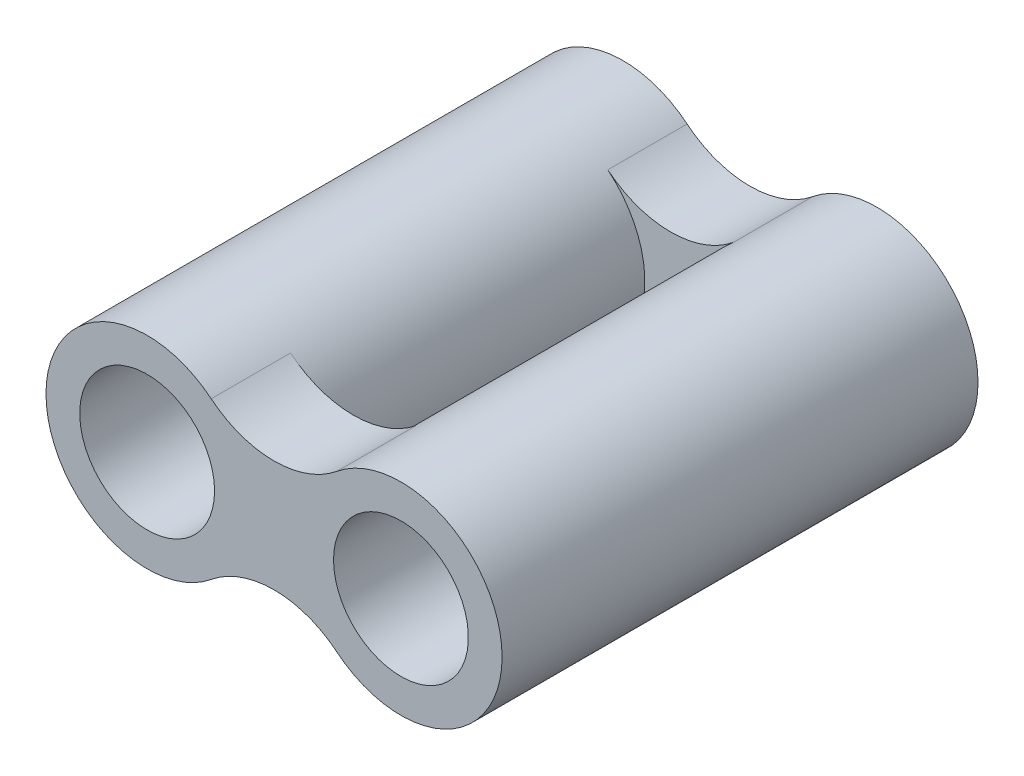
ISO-10303-21;
HEADER;
FILE_DESCRIPTION(('STEP AP214'),'2;1');
FILE_NAME('part.step','',(''),(''),'','','');
FILE_SCHEMA(('AUTOMOTIVE_DESIGN { 1 0 10303 214 1 1 1 1 }'));
ENDSEC;
DATA;
#1=APPLICATION_CONTEXT('core data for automotive mechanical design processes');
#2=APPLICATION_PROTOCOL_DEFINITION('international standard','automotive_design',2000,#1);
#3=PRODUCT_CONTEXT('',#1,'mechanical');
#4=PRODUCT('Part','Part','',(#3));
#5=PRODUCT_RELATED_PRODUCT_CATEGORY('part','',(#4));
#6=PRODUCT_DEFINITION_FORMATION('','',#4);
#7=PRODUCT_DEFINITION_CONTEXT('part definition',#1,'design');
#8=PRODUCT_DEFINITION('design','',#6,#7);
#9=PRODUCT_DEFINITION_SHAPE('','',#8);
#10=(LENGTH_UNIT() NAMED_UNIT(*) SI_UNIT(.MILLI.,.METRE.));
#11=(NAMED_UNIT(*) PLANE_ANGLE_UNIT() SI_UNIT($,.RADIAN.));
#12=(NAMED_UNIT(*) SI_UNIT($,.STERADIAN.) SOLID_ANGLE_UNIT());
#13=UNCERTAINTY_MEASURE_WITH_UNIT(LENGTH_MEASURE(1.E-05),#10,'distance_accuracy_value','');
#14=(GEOMETRIC_REPRESENTATION_CONTEXT(3) GLOBAL_UNCERTAINTY_ASSIGNED_CONTEXT((#13)) GLOBAL_UNIT_ASSIGNED_CONTEXT((#10,
#11,#12)) REPRESENTATION_CONTEXT('',''));
#15=CARTESIAN_POINT('',(0.,0.,0.));
#16=DIRECTION('',(0.,0.,1.));
#17=DIRECTION('',(1.,0.,0.));
#18=AXIS2_PLACEMENT_3D('',#15,#16,#17);
#19=CARTESIAN_POINT('',(1.6,1.95336248556176,2.));
#20=DIRECTION('',(0.,0.,1.));
#21=DIRECTION('',(1.,0.,0.));
#22=AXIS2_PLACEMENT_3D('',#19,#20,#21);
#23=PLANE('',#22);
#24=CARTESIAN_POINT('',(0.,-3.90672497112351,2.));
#25=DIRECTION('',(0.,0.,-1.));
#26=DIRECTION('',(-1.,0.,0.));
#27=AXIS2_PLACEMENT_3D('',#24,#25,#26);
#28=CIRCLE('',#27,2.5);
#29=CARTESIAN_POINT('',(-1.58415841584158,-1.97270270819108,2.));
#30=VERTEX_POINT('',#29);
#31=CARTESIAN_POINT('',(1.58415841584159,-1.97270270819108,2.));
#32=VERTEX_POINT('',#31);
#33=EDGE_CURVE('E158',#30,#32,#28,.T.);
#34=ORIENTED_EDGE('',*,*,#33,.T.);
#35=CARTESIAN_POINT('',(3.2,0.,2.));
#36=DIRECTION('',(0.,0.,1.));
#37=DIRECTION('',(1.,0.,0.));
#38=AXIS2_PLACEMENT_3D('',#35,#36,#37);
#39=CIRCLE('',#38,2.55);
#40=CARTESIAN_POINT('',(1.58415841584159,1.97270270819108,2.));
#41=VERTEX_POINT('',#40);
#42=EDGE_CURVE('E111',#41,#32,#39,.T.);
#43=ORIENTED_EDGE('',*,*,#42,.F.);
#44=CARTESIAN_POINT('',(0.,3.90672497112351,2.));
#45=DIRECTION('',(0.,0.,-1.));
#46=DIRECTION('',(1.,0.,0.));
#47=AXIS2_PLACEMENT_3D('',#44,#45,#46);
#48=CIRCLE('',#47,2.5);
#49=CARTESIAN_POINT('',(-1.58415841584158,1.97270270819108,2.));
#50=VERTEX_POINT('',#49);
#51=EDGE_CURVE('E154',#41,#50,#48,.T.);
#52=ORIENTED_EDGE('',*,*,#51,.T.);
#53=CARTESIAN_POINT('',(-3.2,0.,2.));
#54=DIRECTION('',(0.,0.,1.));
#55=DIRECTION('',(1.,0.,0.));
#56=AXIS2_PLACEMENT_3D('',#53,#54,#55);
#57=CIRCLE('',#56,2.55);
#58=EDGE_CURVE('E11',#30,#50,#57,.T.);
#59=ORIENTED_EDGE('',*,*,#58,.F.);
#60=EDGE_LOOP('',(#34,#43,#52,#59));
#61=FACE_BOUND('',#60,.T.);
#62=ADVANCED_FACE('F41',(#61),#23,.T.);
#63=CARTESIAN_POINT('',(1.6,1.95336248556176,0.));
#64=DIRECTION('',(0.,0.,1.));
#65=DIRECTION('',(1.,0.,0.));
#66=AXIS2_PLACEMENT_3D('',#63,#64,#65);
#67=PLANE('',#66);
#68=CARTESIAN_POINT('',(0.,3.90672497112351,0.));
#69=DIRECTION('',(0.,0.,-1.));
#70=DIRECTION('',(1.,0.,0.));
#71=AXIS2_PLACEMENT_3D('',#68,#69,#70);
#72=CIRCLE('',#71,2.5);
#73=CARTESIAN_POINT('',(1.58415841584159,1.97270270819108,0.));
#74=VERTEX_POINT('',#73);
#75=CARTESIAN_POINT('',(-1.58415841584158,1.97270270819108,0.));
#76=VERTEX_POINT('',#75);
#77=EDGE_CURVE('E152',#74,#76,#72,.T.);
#78=ORIENTED_EDGE('',*,*,#77,.F.);
#79=CARTESIAN_POINT('',(3.2,0.,0.));
#80=DIRECTION('',(0.,0.,1.));
#81=DIRECTION('',(-1.,0.,0.));
#82=AXIS2_PLACEMENT_3D('',#79,#80,#81);
#83=CIRCLE('',#82,2.55);
#84=CARTESIAN_POINT('',(1.58415841584159,-1.97270270819108,0.));
#85=VERTEX_POINT('',#84);
#86=EDGE_CURVE('E157',#85,#74,#83,.T.);
#87=ORIENTED_EDGE('',*,*,#86,.F.);
#88=CARTESIAN_POINT('',(0.,-3.90672497112351,0.));
#89=DIRECTION('',(0.,0.,-1.));
#90=DIRECTION('',(-1.,0.,0.));
#91=AXIS2_PLACEMENT_3D('',#88,#89,#90);
#92=CIRCLE('',#91,2.5);
#93=CARTESIAN_POINT('',(-1.58415841584158,-1.97270270819108,0.));
#94=VERTEX_POINT('',#93);
#95=EDGE_CURVE('E167',#94,#85,#92,.T.);
#96=ORIENTED_EDGE('',*,*,#95,.F.);
#97=CARTESIAN_POINT('',(-3.2,0.,0.));
#98=DIRECTION('',(0.,0.,1.));
#99=DIRECTION('',(1.,0.,0.));
#100=AXIS2_PLACEMENT_3D('',#97,#98,#99);
#101=CIRCLE('',#100,2.55);
#102=EDGE_CURVE('E163',#76,#94,#101,.T.);
#103=ORIENTED_EDGE('',*,*,#102,.F.);
#104=EDGE_LOOP('',(#78,#87,#96,#103));
#105=FACE_BOUND('',#104,.T.);
#106=CARTESIAN_POINT('',(-3.2,0.,0.));
#107=DIRECTION('',(0.,0.,1.));
#108=DIRECTION('',(1.,0.,0.));
#109=AXIS2_PLACEMENT_3D('',#106,#107,#108);
#110=CIRCLE('',#109,1.7);
#111=CARTESIAN_POINT('',(-1.5,0.,0.));
#112=VERTEX_POINT('',#111);
#113=EDGE_CURVE('E151',#112,#112,#110,.T.);
#114=ORIENTED_EDGE('',*,*,#113,.T.);
#115=EDGE_LOOP('',(#114));
#116=FACE_BOUND('',#115,.T.);
#117=CARTESIAN_POINT('',(3.2,0.,0.));
#118=DIRECTION('',(0.,0.,1.));
#119=DIRECTION('',(-1.,0.,0.));
#120=AXIS2_PLACEMENT_3D('',#117,#118,#119);
#121=CIRCLE('',#120,1.7);
#122=CARTESIAN_POINT('',(1.5,0.,0.));
#123=VERTEX_POINT('',#122);
#124=EDGE_CURVE('E114',#123,#123,#121,.T.);
#125=ORIENTED_EDGE('',*,*,#124,.T.);
#126=EDGE_LOOP('',(#125));
#127=FACE_BOUND('',#126,.T.);
#128=ADVANCED_FACE('F186',(#105,#116,#127),#67,.F.);
#129=CARTESIAN_POINT('',(0.,3.90672497112351,2.));
#130=DIRECTION('',(0.,0.,-1.));
#131=DIRECTION('',(-1.,0.,0.));
#132=AXIS2_PLACEMENT_3D('',#129,#130,#131);
#133=CYLINDRICAL_SURFACE('',#132,2.5);
#134=ORIENTED_EDGE('',*,*,#77,.T.);
#135=DIRECTION('',(0.,0.,-1.));
#136=VECTOR('',#135,1.);
#137=CARTESIAN_POINT('',(-1.58415841584158,1.97270270819108,2.));
#138=LINE('',#137,#136);
#139=EDGE_CURVE('E44',#50,#76,#138,.T.);
#140=ORIENTED_EDGE('',*,*,#139,.F.);
#141=ORIENTED_EDGE('',*,*,#51,.F.);
#142=DIRECTION('',(0.,0.,-1.));
#143=VECTOR('',#142,1.);
#144=CARTESIAN_POINT('',(1.58415841584159,1.97270270819108,2.));
#145=LINE('',#144,#143);
#146=EDGE_CURVE('E161',#41,#74,#145,.T.);
#147=ORIENTED_EDGE('',*,*,#146,.T.);
#148=EDGE_LOOP('',(#134,#140,#141,#147));
#149=FACE_BOUND('',#148,.T.);
#150=ADVANCED_FACE('F43',(#149),#133,.F.);
#151=CARTESIAN_POINT('',(-3.2,0.,2.));
#152=DIRECTION('',(0.,0.,-1.));
#153=DIRECTION('',(-1.,0.,0.));
#154=AXIS2_PLACEMENT_3D('',#151,#152,#153);
#155=CYLINDRICAL_SURFACE('',#154,2.55);
#156=ORIENTED_EDGE('',*,*,#102,.T.);
#157=DIRECTION('',(0.,0.,-1.));
#158=VECTOR('',#157,1.);
#159=CARTESIAN_POINT('',(-1.58415841584158,-1.97270270819108,2.));
#160=LINE('',#159,#158);
#161=EDGE_CURVE('E175',#30,#94,#160,.T.);
#162=ORIENTED_EDGE('',*,*,#161,.F.);
#163=ORIENTED_EDGE('',*,*,#58,.T.);
#164=ORIENTED_EDGE('',*,*,#139,.T.);
#165=EDGE_LOOP('',(#156,#162,#163,#164));
#166=FACE_BOUND('',#165,.T.);
#167=CARTESIAN_POINT('',(-3.2,0.,10.));
#168=DIRECTION('',(0.,0.,1.));
#169=DIRECTION('',(1.,0.,0.));
#170=AXIS2_PLACEMENT_3D('',#167,#168,#169);
#171=CIRCLE('',#170,2.55);
#172=CARTESIAN_POINT('',(-1.58415841584158,-1.97270270819108,10.));
#173=VERTEX_POINT('',#172);
#174=CARTESIAN_POINT('',(-1.58415841584158,1.97270270819108,10.));
#175=VERTEX_POINT('',#174);
#176=EDGE_CURVE('E60',#173,#175,#171,.T.);
#177=ORIENTED_EDGE('',*,*,#176,.F.);
#178=DIRECTION('',(0.,0.,1.));
#179=VECTOR('',#178,1.);
#180=CARTESIAN_POINT('',(-1.58415841584158,-1.97270270819108,10.));
#181=LINE('',#180,#179);
#182=CARTESIAN_POINT('',(-1.58415841584158,-1.97270270819108,12.));
#183=VERTEX_POINT('',#182);
#184=EDGE_CURVE('E141',#173,#183,#181,.T.);
#185=ORIENTED_EDGE('',*,*,#184,.T.);
#186=CARTESIAN_POINT('',(-3.2,0.,12.));
#187=DIRECTION('',(0.,0.,1.));
#188=DIRECTION('',(1.,0.,0.));
#189=AXIS2_PLACEMENT_3D('',#186,#187,#188);
#190=CIRCLE('',#189,2.55);
#191=CARTESIAN_POINT('',(-1.58415841584158,1.97270270819108,12.));
#192=VERTEX_POINT('',#191);
#193=EDGE_CURVE('E127',#192,#183,#190,.T.);
#194=ORIENTED_EDGE('',*,*,#193,.F.);
#195=DIRECTION('',(0.,0.,1.));
#196=VECTOR('',#195,1.);
#197=CARTESIAN_POINT('',(-1.58415841584158,1.97270270819108,10.));
#198=LINE('',#197,#196);
#199=EDGE_CURVE('E126',#175,#192,#198,.T.);
#200=ORIENTED_EDGE('',*,*,#199,.F.);
#201=EDGE_LOOP('',(#177,#185,#194,#200));
#202=FACE_BOUND('',#201,.T.);
#203=ADVANCED_FACE('F182',(#166,#202),#155,.T.);
#204=CARTESIAN_POINT('',(0.,-3.90672497112351,2.));
#205=DIRECTION('',(0.,0.,-1.));
#206=DIRECTION('',(-1.,0.,0.));
#207=AXIS2_PLACEMENT_3D('',#204,#205,#206);
#208=CYLINDRICAL_SURFACE('',#207,2.5);
#209=ORIENTED_EDGE('',*,*,#95,.T.);
#210=DIRECTION('',(0.,0.,-1.));
#211=VECTOR('',#210,1.);
#212=CARTESIAN_POINT('',(1.58415841584159,-1.97270270819108,2.));
#213=LINE('',#212,#211);
#214=EDGE_CURVE('E174',#32,#85,#213,.T.);
#215=ORIENTED_EDGE('',*,*,#214,.F.);
#216=ORIENTED_EDGE('',*,*,#33,.F.);
#217=ORIENTED_EDGE('',*,*,#161,.T.);
#218=EDGE_LOOP('',(#209,#215,#216,#217));
#219=FACE_BOUND('',#218,.T.);
#220=ADVANCED_FACE('F187',(#219),#208,.F.);
#221=CARTESIAN_POINT('',(3.2,0.,2.));
#222=DIRECTION('',(0.,0.,-1.));
#223=DIRECTION('',(-1.,0.,0.));
#224=AXIS2_PLACEMENT_3D('',#221,#222,#223);
#225=CYLINDRICAL_SURFACE('',#224,2.55);
#226=ORIENTED_EDGE('',*,*,#86,.T.);
#227=ORIENTED_EDGE('',*,*,#146,.F.);
#228=ORIENTED_EDGE('',*,*,#42,.T.);
#229=ORIENTED_EDGE('',*,*,#214,.T.);
#230=EDGE_LOOP('',(#226,#227,#228,#229));
#231=FACE_BOUND('',#230,.T.);
#232=CARTESIAN_POINT('',(3.2,0.,10.));
#233=DIRECTION('',(0.,0.,1.));
#234=DIRECTION('',(1.,0.,0.));
#235=AXIS2_PLACEMENT_3D('',#232,#233,#234);
#236=CIRCLE('',#235,2.55);
#237=CARTESIAN_POINT('',(1.58415841584159,1.97270270819108,10.));
#238=VERTEX_POINT('',#237);
#239=CARTESIAN_POINT('',(1.58415841584159,-1.97270270819108,10.));
#240=VERTEX_POINT('',#239);
#241=EDGE_CURVE('E62',#238,#240,#236,.T.);
#242=ORIENTED_EDGE('',*,*,#241,.F.);
#243=DIRECTION('',(0.,0.,1.));
#244=VECTOR('',#243,1.);
#245=CARTESIAN_POINT('',(1.58415841584159,1.97270270819108,10.));
#246=LINE('',#245,#244);
#247=CARTESIAN_POINT('',(1.58415841584159,1.97270270819108,12.));
#248=VERTEX_POINT('',#247);
#249=EDGE_CURVE('E108',#238,#248,#246,.T.);
#250=ORIENTED_EDGE('',*,*,#249,.T.);
#251=CARTESIAN_POINT('',(3.2,0.,12.));
#252=DIRECTION('',(0.,0.,1.));
#253=DIRECTION('',(-1.,0.,0.));
#254=AXIS2_PLACEMENT_3D('',#251,#252,#253);
#255=CIRCLE('',#254,2.55);
#256=CARTESIAN_POINT('',(1.58415841584159,-1.97270270819108,12.));
#257=VERTEX_POINT('',#256);
#258=EDGE_CURVE('E140',#257,#248,#255,.T.);
#259=ORIENTED_EDGE('',*,*,#258,.F.);
#260=DIRECTION('',(0.,0.,1.));
#261=VECTOR('',#260,1.);
#262=CARTESIAN_POINT('',(1.58415841584159,-1.97270270819108,10.));
#263=LINE('',#262,#261);
#264=EDGE_CURVE('E112',#240,#257,#263,.T.);
#265=ORIENTED_EDGE('',*,*,#264,.F.);
#266=EDGE_LOOP('',(#242,#250,#259,#265));
#267=FACE_BOUND('',#266,.T.);
#268=ADVANCED_FACE('F110',(#231,#267),#225,.T.);
#269=CARTESIAN_POINT('',(-3.2,0.,2.));
#270=DIRECTION('',(0.,0.,-1.));
#271=DIRECTION('',(-1.,0.,0.));
#272=AXIS2_PLACEMENT_3D('',#269,#270,#271);
#273=CYLINDRICAL_SURFACE('',#272,1.7);
#274=ORIENTED_EDGE('',*,*,#113,.F.);
#275=EDGE_LOOP('',(#274));
#276=FACE_BOUND('',#275,.T.);
#277=CARTESIAN_POINT('',(-3.2,0.,12.));
#278=DIRECTION('',(0.,0.,1.));
#279=DIRECTION('',(1.,0.,0.));
#280=AXIS2_PLACEMENT_3D('',#277,#278,#279);
#281=CIRCLE('',#280,1.7);
#282=CARTESIAN_POINT('',(-1.5,0.,12.));
#283=VERTEX_POINT('',#282);
#284=EDGE_CURVE('E133',#283,#283,#281,.T.);
#285=ORIENTED_EDGE('',*,*,#284,.T.);
#286=EDGE_LOOP('',(#285));
#287=FACE_BOUND('',#286,.T.);
#288=ADVANCED_FACE('F201',(#276,#287),#273,.F.);
#289=CARTESIAN_POINT('',(3.2,0.,2.));
#290=DIRECTION('',(0.,0.,-1.));
#291=DIRECTION('',(-1.,0.,0.));
#292=AXIS2_PLACEMENT_3D('',#289,#290,#291);
#293=CYLINDRICAL_SURFACE('',#292,1.7);
#294=ORIENTED_EDGE('',*,*,#124,.F.);
#295=EDGE_LOOP('',(#294));
#296=FACE_BOUND('',#295,.T.);
#297=CARTESIAN_POINT('',(3.2,0.,12.));
#298=DIRECTION('',(0.,0.,1.));
#299=DIRECTION('',(-1.,0.,0.));
#300=AXIS2_PLACEMENT_3D('',#297,#298,#299);
#301=CIRCLE('',#300,1.7);
#302=CARTESIAN_POINT('',(1.5,0.,12.));
#303=VERTEX_POINT('',#302);
#304=EDGE_CURVE('E337',#303,#303,#301,.T.);
#305=ORIENTED_EDGE('',*,*,#304,.T.);
#306=EDGE_LOOP('',(#305));
#307=FACE_BOUND('',#306,.T.);
#308=ADVANCED_FACE('F242',(#296,#307),#293,.F.);
#309=CARTESIAN_POINT('',(1.6,1.95336248556176,10.));
#310=DIRECTION('',(0.,0.,-1.));
#311=DIRECTION('',(1.,0.,0.));
#312=AXIS2_PLACEMENT_3D('',#309,#310,#311);
#313=PLANE('',#312);
#314=CARTESIAN_POINT('',(0.,-3.90672497112351,10.));
#315=DIRECTION('',(0.,0.,-1.));
#316=DIRECTION('',(-1.,0.,0.));
#317=AXIS2_PLACEMENT_3D('',#314,#315,#316);
#318=CIRCLE('',#317,2.5);
#319=EDGE_CURVE('E123',#173,#240,#318,.T.);
#320=ORIENTED_EDGE('',*,*,#319,.F.);
#321=ORIENTED_EDGE('',*,*,#176,.T.);
#322=CARTESIAN_POINT('',(0.,3.90672497112351,10.));
#323=DIRECTION('',(0.,0.,-1.));
#324=DIRECTION('',(1.,0.,0.));
#325=AXIS2_PLACEMENT_3D('',#322,#323,#324);
#326=CIRCLE('',#325,2.5);
#327=EDGE_CURVE('E118',#238,#175,#326,.T.);
#328=ORIENTED_EDGE('',*,*,#327,.F.);
#329=ORIENTED_EDGE('',*,*,#241,.T.);
#330=EDGE_LOOP('',(#320,#321,#328,#329));
#331=FACE_BOUND('',#330,.T.);
#332=ADVANCED_FACE('F121',(#331),#313,.T.);
#333=CARTESIAN_POINT('',(0.,3.90672497112351,10.));
#334=DIRECTION('',(0.,0.,1.));
#335=DIRECTION('',(1.,0.,0.));
#336=AXIS2_PLACEMENT_3D('',#333,#334,#335);
#337=CYLINDRICAL_SURFACE('',#336,2.5);
#338=CARTESIAN_POINT('',(0.,3.90672497112351,12.));
#339=DIRECTION('',(0.,0.,-1.));
#340=DIRECTION('',(1.,0.,0.));
#341=AXIS2_PLACEMENT_3D('',#338,#339,#340);
#342=CIRCLE('',#341,2.5);
#343=EDGE_CURVE('E122',#248,#192,#342,.T.);
#344=ORIENTED_EDGE('',*,*,#343,.F.);
#345=ORIENTED_EDGE('',*,*,#249,.F.);
#346=ORIENTED_EDGE('',*,*,#327,.T.);
#347=ORIENTED_EDGE('',*,*,#199,.T.);
#348=EDGE_LOOP('',(#344,#345,#346,#347));
#349=FACE_BOUND('',#348,.T.);
#350=ADVANCED_FACE('F120',(#349),#337,.F.);
#351=CARTESIAN_POINT('',(0.,-3.90672497112351,10.));
#352=DIRECTION('',(0.,0.,1.));
#353=DIRECTION('',(1.,0.,0.));
#354=AXIS2_PLACEMENT_3D('',#351,#352,#353);
#355=CYLINDRICAL_SURFACE('',#354,2.5);
#356=CARTESIAN_POINT('',(0.,-3.90672497112351,12.));
#357=DIRECTION('',(0.,0.,-1.));
#358=DIRECTION('',(-1.,0.,0.));
#359=AXIS2_PLACEMENT_3D('',#356,#357,#358);
#360=CIRCLE('',#359,2.5);
#361=EDGE_CURVE('E134',#183,#257,#360,.T.);
#362=ORIENTED_EDGE('',*,*,#361,.F.);
#363=ORIENTED_EDGE('',*,*,#184,.F.);
#364=ORIENTED_EDGE('',*,*,#319,.T.);
#365=ORIENTED_EDGE('',*,*,#264,.T.);
#366=EDGE_LOOP('',(#362,#363,#364,#365));
#367=FACE_BOUND('',#366,.T.);
#368=ADVANCED_FACE('F273',(#367),#355,.F.);
#369=CARTESIAN_POINT('',(1.6,1.95336248556176,12.));
#370=DIRECTION('',(0.,0.,-1.));
#371=DIRECTION('',(1.,0.,0.));
#372=AXIS2_PLACEMENT_3D('',#369,#370,#371);
#373=PLANE('',#372);
#374=ORIENTED_EDGE('',*,*,#304,.F.);
#375=EDGE_LOOP('',(#374));
#376=FACE_BOUND('',#375,.T.);
#377=ORIENTED_EDGE('',*,*,#284,.F.);
#378=EDGE_LOOP('',(#377));
#379=FACE_BOUND('',#378,.T.);
#380=ORIENTED_EDGE('',*,*,#343,.T.);
#381=ORIENTED_EDGE('',*,*,#193,.T.);
#382=ORIENTED_EDGE('',*,*,#361,.T.);
#383=ORIENTED_EDGE('',*,*,#258,.T.);
#384=EDGE_LOOP('',(#380,#381,#382,#383));
#385=FACE_BOUND('',#384,.T.);
#386=ADVANCED_FACE('F281',(#376,#379,#385),#373,.F.);
#387=CLOSED_SHELL('',(#62,#128,#150,#203,#220,#268,#288,#308,#332,#350,#368,#386));
#388=MANIFOLD_SOLID_BREP('B2',#387);
#389=ADVANCED_BREP_SHAPE_REPRESENTATION('',(#18,#388),#14);
#390=SHAPE_DEFINITION_REPRESENTATION(#9,#389);
ENDSEC;
END-ISO-10303-21;
